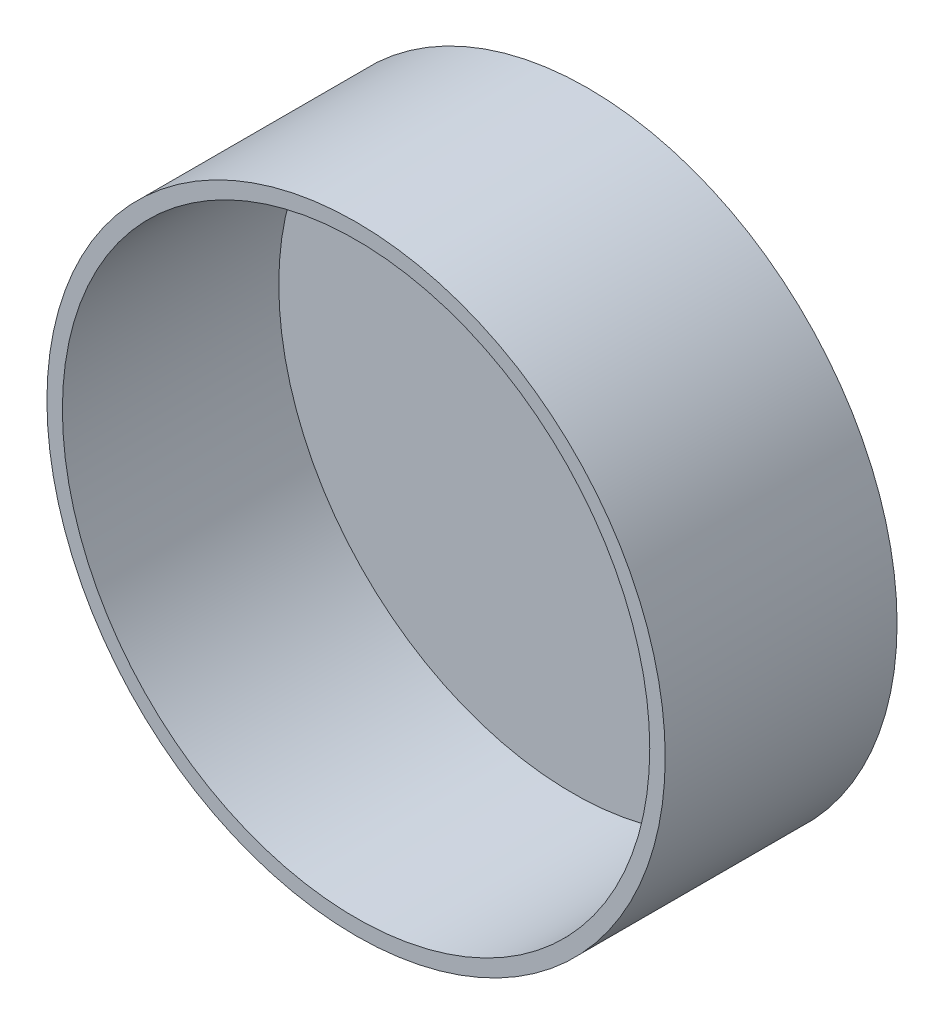
ISO-10303-21;
HEADER;
FILE_DESCRIPTION(('STEP AP214'),'2;1');
FILE_NAME('part.step','',(''),(''),'','','');
FILE_SCHEMA(('AUTOMOTIVE_DESIGN { 1 0 10303 214 1 1 1 1 }'));
ENDSEC;
DATA;
#1=APPLICATION_CONTEXT('core data for automotive mechanical design processes');
#2=APPLICATION_PROTOCOL_DEFINITION('international standard','automotive_design',2000,#1);
#3=PRODUCT_CONTEXT('',#1,'mechanical');
#4=PRODUCT('Part','Part','',(#3));
#5=PRODUCT_RELATED_PRODUCT_CATEGORY('part','',(#4));
#6=PRODUCT_DEFINITION_FORMATION('','',#4);
#7=PRODUCT_DEFINITION_CONTEXT('part definition',#1,'design');
#8=PRODUCT_DEFINITION('design','',#6,#7);
#9=PRODUCT_DEFINITION_SHAPE('','',#8);
#10=(LENGTH_UNIT() NAMED_UNIT(*) SI_UNIT(.MILLI.,.METRE.));
#11=(NAMED_UNIT(*) PLANE_ANGLE_UNIT() SI_UNIT($,.RADIAN.));
#12=(NAMED_UNIT(*) SI_UNIT($,.STERADIAN.) SOLID_ANGLE_UNIT());
#13=UNCERTAINTY_MEASURE_WITH_UNIT(LENGTH_MEASURE(1.E-05),#10,'distance_accuracy_value','');
#14=(GEOMETRIC_REPRESENTATION_CONTEXT(3) GLOBAL_UNCERTAINTY_ASSIGNED_CONTEXT((#13)) GLOBAL_UNIT_ASSIGNED_CONTEXT((#10,
#11,#12)) REPRESENTATION_CONTEXT('',''));
#15=CARTESIAN_POINT('',(0.,0.,0.));
#16=DIRECTION('',(0.,0.,1.));
#17=DIRECTION('',(1.,0.,0.));
#18=AXIS2_PLACEMENT_3D('',#15,#16,#17);
#19=CARTESIAN_POINT('',(0.,0.,70.));
#20=DIRECTION('',(0.,0.,1.));
#21=DIRECTION('',(1.,0.,0.));
#22=AXIS2_PLACEMENT_3D('',#19,#20,#21);
#23=PLANE('',#22);
#24=CARTESIAN_POINT('',(0.,0.,70.));
#25=DIRECTION('',(0.,0.,1.));
#26=DIRECTION('',(1.,0.,0.));
#27=AXIS2_PLACEMENT_3D('',#24,#25,#26);
#28=CIRCLE('',#27,100.);
#29=CARTESIAN_POINT('',(100.,0.,70.));
#30=VERTEX_POINT('',#29);
#31=EDGE_CURVE('E10',#30,#30,#28,.T.);
#32=ORIENTED_EDGE('',*,*,#31,.T.);
#33=EDGE_LOOP('',(#32));
#34=FACE_BOUND('',#33,.T.);
#35=CARTESIAN_POINT('',(0.,0.,70.));
#36=DIRECTION('',(0.,0.,1.));
#37=DIRECTION('',(1.,0.,0.));
#38=AXIS2_PLACEMENT_3D('',#35,#36,#37);
#39=CIRCLE('',#38,95.);
#40=CARTESIAN_POINT('',(95.,0.,70.));
#41=VERTEX_POINT('',#40);
#42=EDGE_CURVE('E51',#41,#41,#39,.T.);
#43=ORIENTED_EDGE('',*,*,#42,.F.);
#44=EDGE_LOOP('',(#43));
#45=FACE_BOUND('',#44,.T.);
#46=ADVANCED_FACE('F43',(#34,#45),#23,.T.);
#47=CARTESIAN_POINT('',(0.,0.,70.));
#48=DIRECTION('',(0.,0.,-1.));
#49=DIRECTION('',(-1.,0.,0.));
#50=AXIS2_PLACEMENT_3D('',#47,#48,#49);
#51=CYLINDRICAL_SURFACE('',#50,100.);
#52=ORIENTED_EDGE('',*,*,#31,.F.);
#53=EDGE_LOOP('',(#52));
#54=FACE_BOUND('',#53,.T.);
#55=CARTESIAN_POINT('',(0.,0.,-5.));
#56=DIRECTION('',(0.,0.,-1.));
#57=DIRECTION('',(-1.,0.,0.));
#58=AXIS2_PLACEMENT_3D('',#55,#56,#57);
#59=CIRCLE('',#58,100.);
#60=CARTESIAN_POINT('',(-100.,0.,-5.));
#61=VERTEX_POINT('',#60);
#62=EDGE_CURVE('E62',#61,#61,#59,.T.);
#63=ORIENTED_EDGE('',*,*,#62,.F.);
#64=EDGE_LOOP('',(#63));
#65=FACE_BOUND('',#64,.T.);
#66=ADVANCED_FACE('F45',(#54,#65),#51,.T.);
#67=CARTESIAN_POINT('',(0.,0.,70.));
#68=DIRECTION('',(0.,0.,-1.));
#69=DIRECTION('',(-1.,0.,0.));
#70=AXIS2_PLACEMENT_3D('',#67,#68,#69);
#71=CYLINDRICAL_SURFACE('',#70,95.);
#72=ORIENTED_EDGE('',*,*,#42,.T.);
#73=EDGE_LOOP('',(#72));
#74=FACE_BOUND('',#73,.T.);
#75=CARTESIAN_POINT('',(0.,0.,0.));
#76=DIRECTION('',(0.,0.,1.));
#77=DIRECTION('',(1.,0.,0.));
#78=AXIS2_PLACEMENT_3D('',#75,#76,#77);
#79=CIRCLE('',#78,95.);
#80=CARTESIAN_POINT('',(95.,0.,0.));
#81=VERTEX_POINT('',#80);
#82=EDGE_CURVE('E56',#81,#81,#79,.T.);
#83=ORIENTED_EDGE('',*,*,#82,.F.);
#84=EDGE_LOOP('',(#83));
#85=FACE_BOUND('',#84,.T.);
#86=ADVANCED_FACE('F71',(#74,#85),#71,.F.);
#87=CARTESIAN_POINT('',(0.,0.,0.));
#88=DIRECTION('',(0.,0.,-1.));
#89=DIRECTION('',(-1.,0.,0.));
#90=AXIS2_PLACEMENT_3D('',#87,#88,#89);
#91=PLANE('',#90);
#92=ORIENTED_EDGE('',*,*,#82,.T.);
#93=EDGE_LOOP('',(#92));
#94=FACE_BOUND('',#93,.T.);
#95=ADVANCED_FACE('F77',(#94),#91,.F.);
#96=CARTESIAN_POINT('',(0.,0.,-5.));
#97=DIRECTION('',(0.,0.,-1.));
#98=DIRECTION('',(-1.,0.,0.));
#99=AXIS2_PLACEMENT_3D('',#96,#97,#98);
#100=PLANE('',#99);
#101=ORIENTED_EDGE('',*,*,#62,.T.);
#102=EDGE_LOOP('',(#101));
#103=FACE_BOUND('',#102,.T.);
#104=ADVANCED_FACE('F68',(#103),#100,.T.);
#105=CLOSED_SHELL('',(#46,#66,#86,#95,#104));
#106=MANIFOLD_SOLID_BREP('B2',#105);
#107=ADVANCED_BREP_SHAPE_REPRESENTATION('',(#18,#106),#14);
#108=SHAPE_DEFINITION_REPRESENTATION(#9,#107);
ENDSEC;
END-ISO-10303-21;
